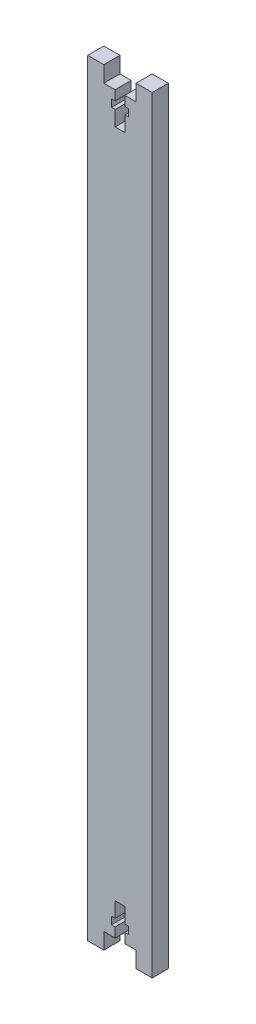
ISO-10303-21;
HEADER;
FILE_DESCRIPTION(('STEP AP214'),'2;1');
FILE_NAME('part.step','',(''),(''),'','','');
FILE_SCHEMA(('AUTOMOTIVE_DESIGN { 1 0 10303 214 1 1 1 1 }'));
ENDSEC;
DATA;
#1=APPLICATION_CONTEXT('core data for automotive mechanical design processes');
#2=APPLICATION_PROTOCOL_DEFINITION('international standard','automotive_design',2000,#1);
#3=PRODUCT_CONTEXT('',#1,'mechanical');
#4=PRODUCT('Part','Part','',(#3));
#5=PRODUCT_RELATED_PRODUCT_CATEGORY('part','',(#4));
#6=PRODUCT_DEFINITION_FORMATION('','',#4);
#7=PRODUCT_DEFINITION_CONTEXT('part definition',#1,'design');
#8=PRODUCT_DEFINITION('design','',#6,#7);
#9=PRODUCT_DEFINITION_SHAPE('','',#8);
#10=(LENGTH_UNIT() NAMED_UNIT(*) SI_UNIT(.MILLI.,.METRE.));
#11=(NAMED_UNIT(*) PLANE_ANGLE_UNIT() SI_UNIT($,.RADIAN.));
#12=(NAMED_UNIT(*) SI_UNIT($,.STERADIAN.) SOLID_ANGLE_UNIT());
#13=UNCERTAINTY_MEASURE_WITH_UNIT(LENGTH_MEASURE(1.E-05),#10,'distance_accuracy_value','');
#14=(GEOMETRIC_REPRESENTATION_CONTEXT(3) GLOBAL_UNCERTAINTY_ASSIGNED_CONTEXT((#13)) GLOBAL_UNIT_ASSIGNED_CONTEXT((#10,
#11,#12)) REPRESENTATION_CONTEXT('',''));
#15=CARTESIAN_POINT('',(0.,0.,0.));
#16=DIRECTION('',(0.,0.,1.));
#17=DIRECTION('',(1.,0.,0.));
#18=AXIS2_PLACEMENT_3D('',#15,#16,#17);
#19=CARTESIAN_POINT('',(5.,0.,5.));
#20=DIRECTION('',(0.,1.,0.));
#21=DIRECTION('',(0.,0.,1.));
#22=AXIS2_PLACEMENT_3D('',#19,#20,#21);
#23=PLANE('',#22);
#24=DIRECTION('',(1.,0.,0.));
#25=VECTOR('',#24,1.);
#26=CARTESIAN_POINT('',(5.,0.,0.));
#27=LINE('',#26,#25);
#28=CARTESIAN_POINT('',(0.,0.,0.));
#29=VERTEX_POINT('',#28);
#30=CARTESIAN_POINT('',(5.,0.,0.));
#31=VERTEX_POINT('',#30);
#32=EDGE_CURVE('E298',#29,#31,#27,.T.);
#33=ORIENTED_EDGE('',*,*,#32,.T.);
#34=DIRECTION('',(0.,0.,-1.));
#35=VECTOR('',#34,1.);
#36=CARTESIAN_POINT('',(5.,0.,5.));
#37=LINE('',#36,#35);
#38=CARTESIAN_POINT('',(5.,0.,5.));
#39=VERTEX_POINT('',#38);
#40=EDGE_CURVE('E42',#39,#31,#37,.T.);
#41=ORIENTED_EDGE('',*,*,#40,.F.);
#42=DIRECTION('',(1.,0.,0.));
#43=VECTOR('',#42,1.);
#44=CARTESIAN_POINT('',(5.,0.,5.));
#45=LINE('',#44,#43);
#46=CARTESIAN_POINT('',(0.,0.,5.));
#47=VERTEX_POINT('',#46);
#48=EDGE_CURVE('E556',#47,#39,#45,.T.);
#49=ORIENTED_EDGE('',*,*,#48,.F.);
#50=DIRECTION('',(0.,0.,-1.));
#51=VECTOR('',#50,1.);
#52=CARTESIAN_POINT('',(0.,0.,5.));
#53=LINE('',#52,#51);
#54=EDGE_CURVE('E11',#47,#29,#53,.T.);
#55=ORIENTED_EDGE('',*,*,#54,.T.);
#56=EDGE_LOOP('',(#33,#41,#49,#55));
#57=FACE_BOUND('',#56,.T.);
#58=ADVANCED_FACE('F34',(#57),#23,.F.);
#59=CARTESIAN_POINT('',(5.,0.,5.));
#60=DIRECTION('',(-1.,0.,0.));
#61=DIRECTION('',(0.,-1.,0.));
#62=AXIS2_PLACEMENT_3D('',#59,#60,#61);
#63=PLANE('',#62);
#64=DIRECTION('',(0.,1.,0.));
#65=VECTOR('',#64,1.);
#66=CARTESIAN_POINT('',(5.,0.,0.));
#67=LINE('',#66,#65);
#68=CARTESIAN_POINT('',(5.,5.,0.));
#69=VERTEX_POINT('',#68);
#70=EDGE_CURVE('E300',#31,#69,#67,.T.);
#71=ORIENTED_EDGE('',*,*,#70,.T.);
#72=DIRECTION('',(0.,0.,-1.));
#73=VECTOR('',#72,1.);
#74=CARTESIAN_POINT('',(5.,5.,5.));
#75=LINE('',#74,#73);
#76=CARTESIAN_POINT('',(5.,5.,5.));
#77=VERTEX_POINT('',#76);
#78=EDGE_CURVE('E458',#77,#69,#75,.T.);
#79=ORIENTED_EDGE('',*,*,#78,.F.);
#80=DIRECTION('',(0.,1.,0.));
#81=VECTOR('',#80,1.);
#82=CARTESIAN_POINT('',(5.,0.,5.));
#83=LINE('',#82,#81);
#84=EDGE_CURVE('E467',#39,#77,#83,.T.);
#85=ORIENTED_EDGE('',*,*,#84,.F.);
#86=ORIENTED_EDGE('',*,*,#40,.T.);
#87=EDGE_LOOP('',(#71,#79,#85,#86));
#88=FACE_BOUND('',#87,.T.);
#89=ADVANCED_FACE('F465',(#88),#63,.F.);
#90=CARTESIAN_POINT('',(8.50000000000001,5.,5.));
#91=DIRECTION('',(0.,1.,0.));
#92=DIRECTION('',(-1.,0.,0.));
#93=AXIS2_PLACEMENT_3D('',#90,#91,#92);
#94=PLANE('',#93);
#95=DIRECTION('',(1.,0.,0.));
#96=VECTOR('',#95,1.);
#97=CARTESIAN_POINT('',(8.50000000000001,5.,0.));
#98=LINE('',#97,#96);
#99=CARTESIAN_POINT('',(8.50000000000001,5.,0.));
#100=VERTEX_POINT('',#99);
#101=EDGE_CURVE('E302',#69,#100,#98,.T.);
#102=ORIENTED_EDGE('',*,*,#101,.T.);
#103=DIRECTION('',(0.,0.,-1.));
#104=VECTOR('',#103,1.);
#105=CARTESIAN_POINT('',(8.50000000000001,5.,5.));
#106=LINE('',#105,#104);
#107=CARTESIAN_POINT('',(8.50000000000001,5.,5.));
#108=VERTEX_POINT('',#107);
#109=EDGE_CURVE('E455',#108,#100,#106,.T.);
#110=ORIENTED_EDGE('',*,*,#109,.F.);
#111=DIRECTION('',(1.,0.,0.));
#112=VECTOR('',#111,1.);
#113=CARTESIAN_POINT('',(8.50000000000001,5.,5.));
#114=LINE('',#113,#112);
#115=EDGE_CURVE('E488',#77,#108,#114,.T.);
#116=ORIENTED_EDGE('',*,*,#115,.F.);
#117=ORIENTED_EDGE('',*,*,#78,.T.);
#118=EDGE_LOOP('',(#102,#110,#116,#117));
#119=FACE_BOUND('',#118,.T.);
#120=ADVANCED_FACE('F479',(#119),#94,.F.);
#121=CARTESIAN_POINT('',(8.5,8.,5.));
#122=DIRECTION('',(-1.,0.,0.));
#123=DIRECTION('',(0.,-1.,0.));
#124=AXIS2_PLACEMENT_3D('',#121,#122,#123);
#125=PLANE('',#124);
#126=DIRECTION('',(0.,1.,0.));
#127=VECTOR('',#126,1.);
#128=CARTESIAN_POINT('',(8.5,8.,0.));
#129=LINE('',#128,#127);
#130=CARTESIAN_POINT('',(8.5,8.,0.));
#131=VERTEX_POINT('',#130);
#132=EDGE_CURVE('E304',#100,#131,#129,.T.);
#133=ORIENTED_EDGE('',*,*,#132,.T.);
#134=DIRECTION('',(0.,0.,-1.));
#135=VECTOR('',#134,1.);
#136=CARTESIAN_POINT('',(8.5,8.,5.));
#137=LINE('',#136,#135);
#138=CARTESIAN_POINT('',(8.5,8.,5.));
#139=VERTEX_POINT('',#138);
#140=EDGE_CURVE('E452',#139,#131,#137,.T.);
#141=ORIENTED_EDGE('',*,*,#140,.F.);
#142=DIRECTION('',(0.,1.,0.));
#143=VECTOR('',#142,1.);
#144=CARTESIAN_POINT('',(8.5,8.,5.));
#145=LINE('',#144,#143);
#146=EDGE_CURVE('E485',#108,#139,#145,.T.);
#147=ORIENTED_EDGE('',*,*,#146,.F.);
#148=ORIENTED_EDGE('',*,*,#109,.T.);
#149=EDGE_LOOP('',(#133,#141,#147,#148));
#150=FACE_BOUND('',#149,.T.);
#151=ADVANCED_FACE('F483',(#150),#125,.F.);
#152=CARTESIAN_POINT('',(8.5,8.,5.));
#153=DIRECTION('',(0.,-1.,0.));
#154=DIRECTION('',(1.,0.,0.));
#155=AXIS2_PLACEMENT_3D('',#152,#153,#154);
#156=PLANE('',#155);
#157=DIRECTION('',(-1.,0.,0.));
#158=VECTOR('',#157,1.);
#159=CARTESIAN_POINT('',(8.5,8.,0.));
#160=LINE('',#159,#158);
#161=CARTESIAN_POINT('',(7.4,8.00000000000001,0.));
#162=VERTEX_POINT('',#161);
#163=EDGE_CURVE('E306',#131,#162,#160,.T.);
#164=ORIENTED_EDGE('',*,*,#163,.T.);
#165=DIRECTION('',(0.,0.,-1.));
#166=VECTOR('',#165,1.);
#167=CARTESIAN_POINT('',(7.4,8.00000000000001,5.));
#168=LINE('',#167,#166);
#169=CARTESIAN_POINT('',(7.4,8.00000000000001,5.));
#170=VERTEX_POINT('',#169);
#171=EDGE_CURVE('E449',#170,#162,#168,.T.);
#172=ORIENTED_EDGE('',*,*,#171,.F.);
#173=DIRECTION('',(-1.,0.,0.));
#174=VECTOR('',#173,1.);
#175=CARTESIAN_POINT('',(8.5,8.,5.));
#176=LINE('',#175,#174);
#177=EDGE_CURVE('E487',#139,#170,#176,.T.);
#178=ORIENTED_EDGE('',*,*,#177,.F.);
#179=ORIENTED_EDGE('',*,*,#140,.T.);
#180=EDGE_LOOP('',(#164,#172,#178,#179));
#181=FACE_BOUND('',#180,.T.);
#182=ADVANCED_FACE('F570',(#181),#156,.F.);
#183=CARTESIAN_POINT('',(7.4,8.00000000000001,5.));
#184=DIRECTION('',(-1.,0.,0.));
#185=DIRECTION('',(0.,-1.,0.));
#186=AXIS2_PLACEMENT_3D('',#183,#184,#185);
#187=PLANE('',#186);
#188=DIRECTION('',(0.,1.,0.));
#189=VECTOR('',#188,1.);
#190=CARTESIAN_POINT('',(7.4,8.00000000000001,0.));
#191=LINE('',#190,#189);
#192=CARTESIAN_POINT('',(7.4,10.3,0.));
#193=VERTEX_POINT('',#192);
#194=EDGE_CURVE('E308',#162,#193,#191,.T.);
#195=ORIENTED_EDGE('',*,*,#194,.T.);
#196=DIRECTION('',(0.,0.,-1.));
#197=VECTOR('',#196,1.);
#198=CARTESIAN_POINT('',(7.4,10.3,5.));
#199=LINE('',#198,#197);
#200=CARTESIAN_POINT('',(7.4,10.3,5.));
#201=VERTEX_POINT('',#200);
#202=EDGE_CURVE('E446',#201,#193,#199,.T.);
#203=ORIENTED_EDGE('',*,*,#202,.F.);
#204=DIRECTION('',(0.,1.,0.));
#205=VECTOR('',#204,1.);
#206=CARTESIAN_POINT('',(7.4,8.00000000000001,5.));
#207=LINE('',#206,#205);
#208=EDGE_CURVE('E490',#170,#201,#207,.T.);
#209=ORIENTED_EDGE('',*,*,#208,.F.);
#210=ORIENTED_EDGE('',*,*,#171,.T.);
#211=EDGE_LOOP('',(#195,#203,#209,#210));
#212=FACE_BOUND('',#211,.T.);
#213=ADVANCED_FACE('F573',(#212),#187,.F.);
#214=CARTESIAN_POINT('',(7.4,10.3,5.));
#215=DIRECTION('',(0.,1.,0.));
#216=DIRECTION('',(-1.,0.,0.));
#217=AXIS2_PLACEMENT_3D('',#214,#215,#216);
#218=PLANE('',#217);
#219=DIRECTION('',(1.,0.,0.));
#220=VECTOR('',#219,1.);
#221=CARTESIAN_POINT('',(7.4,10.3,0.));
#222=LINE('',#221,#220);
#223=CARTESIAN_POINT('',(8.5,10.3,0.));
#224=VERTEX_POINT('',#223);
#225=EDGE_CURVE('E310',#193,#224,#222,.T.);
#226=ORIENTED_EDGE('',*,*,#225,.T.);
#227=DIRECTION('',(0.,0.,-1.));
#228=VECTOR('',#227,1.);
#229=CARTESIAN_POINT('',(8.5,10.3,5.));
#230=LINE('',#229,#228);
#231=CARTESIAN_POINT('',(8.5,10.3,5.));
#232=VERTEX_POINT('',#231);
#233=EDGE_CURVE('E443',#232,#224,#230,.T.);
#234=ORIENTED_EDGE('',*,*,#233,.F.);
#235=DIRECTION('',(1.,0.,0.));
#236=VECTOR('',#235,1.);
#237=CARTESIAN_POINT('',(7.4,10.3,5.));
#238=LINE('',#237,#236);
#239=EDGE_CURVE('E496',#201,#232,#238,.T.);
#240=ORIENTED_EDGE('',*,*,#239,.F.);
#241=ORIENTED_EDGE('',*,*,#202,.T.);
#242=EDGE_LOOP('',(#226,#234,#240,#241));
#243=FACE_BOUND('',#242,.T.);
#244=ADVANCED_FACE('F577',(#243),#218,.F.);
#245=CARTESIAN_POINT('',(8.5,15.,5.));
#246=DIRECTION('',(-1.,0.,0.));
#247=DIRECTION('',(0.,-1.,0.));
#248=AXIS2_PLACEMENT_3D('',#245,#246,#247);
#249=PLANE('',#248);
#250=DIRECTION('',(0.,1.,0.));
#251=VECTOR('',#250,1.);
#252=CARTESIAN_POINT('',(8.5,15.,0.));
#253=LINE('',#252,#251);
#254=CARTESIAN_POINT('',(8.5,15.,0.));
#255=VERTEX_POINT('',#254);
#256=EDGE_CURVE('E312',#224,#255,#253,.T.);
#257=ORIENTED_EDGE('',*,*,#256,.T.);
#258=DIRECTION('',(0.,0.,-1.));
#259=VECTOR('',#258,1.);
#260=CARTESIAN_POINT('',(8.5,15.,5.));
#261=LINE('',#260,#259);
#262=CARTESIAN_POINT('',(8.5,15.,5.));
#263=VERTEX_POINT('',#262);
#264=EDGE_CURVE('E440',#263,#255,#261,.T.);
#265=ORIENTED_EDGE('',*,*,#264,.F.);
#266=DIRECTION('',(0.,1.,0.));
#267=VECTOR('',#266,1.);
#268=CARTESIAN_POINT('',(8.5,15.,5.));
#269=LINE('',#268,#267);
#270=EDGE_CURVE('E498',#232,#263,#269,.T.);
#271=ORIENTED_EDGE('',*,*,#270,.F.);
#272=ORIENTED_EDGE('',*,*,#233,.T.);
#273=EDGE_LOOP('',(#257,#265,#271,#272));
#274=FACE_BOUND('',#273,.T.);
#275=ADVANCED_FACE('F581',(#274),#249,.F.);
#276=CARTESIAN_POINT('',(11.5,15.,5.));
#277=DIRECTION('',(0.,1.,0.));
#278=DIRECTION('',(0.,0.,1.));
#279=AXIS2_PLACEMENT_3D('',#276,#277,#278);
#280=PLANE('',#279);
#281=DIRECTION('',(1.,0.,0.));
#282=VECTOR('',#281,1.);
#283=CARTESIAN_POINT('',(11.5,15.,0.));
#284=LINE('',#283,#282);
#285=CARTESIAN_POINT('',(11.5,15.,0.));
#286=VERTEX_POINT('',#285);
#287=EDGE_CURVE('E314',#255,#286,#284,.T.);
#288=ORIENTED_EDGE('',*,*,#287,.T.);
#289=DIRECTION('',(0.,0.,-1.));
#290=VECTOR('',#289,1.);
#291=CARTESIAN_POINT('',(11.5,15.,5.));
#292=LINE('',#291,#290);
#293=CARTESIAN_POINT('',(11.5,15.,5.));
#294=VERTEX_POINT('',#293);
#295=EDGE_CURVE('E437',#294,#286,#292,.T.);
#296=ORIENTED_EDGE('',*,*,#295,.F.);
#297=DIRECTION('',(1.,0.,0.));
#298=VECTOR('',#297,1.);
#299=CARTESIAN_POINT('',(11.5,15.,5.));
#300=LINE('',#299,#298);
#301=EDGE_CURVE('E500',#263,#294,#300,.T.);
#302=ORIENTED_EDGE('',*,*,#301,.F.);
#303=ORIENTED_EDGE('',*,*,#264,.T.);
#304=EDGE_LOOP('',(#288,#296,#302,#303));
#305=FACE_BOUND('',#304,.T.);
#306=ADVANCED_FACE('F585',(#305),#280,.F.);
#307=CARTESIAN_POINT('',(11.5,10.3,5.));
#308=DIRECTION('',(1.,0.,0.));
#309=DIRECTION('',(0.,0.,-1.));
#310=AXIS2_PLACEMENT_3D('',#307,#308,#309);
#311=PLANE('',#310);
#312=DIRECTION('',(0.,-1.,0.));
#313=VECTOR('',#312,1.);
#314=CARTESIAN_POINT('',(11.5,10.3,0.));
#315=LINE('',#314,#313);
#316=CARTESIAN_POINT('',(11.5,10.3,0.));
#317=VERTEX_POINT('',#316);
#318=EDGE_CURVE('E316',#286,#317,#315,.T.);
#319=ORIENTED_EDGE('',*,*,#318,.T.);
#320=DIRECTION('',(0.,0.,-1.));
#321=VECTOR('',#320,1.);
#322=CARTESIAN_POINT('',(11.5,10.3,5.));
#323=LINE('',#322,#321);
#324=CARTESIAN_POINT('',(11.5,10.3,5.));
#325=VERTEX_POINT('',#324);
#326=EDGE_CURVE('E434',#325,#317,#323,.T.);
#327=ORIENTED_EDGE('',*,*,#326,.F.);
#328=DIRECTION('',(0.,-1.,0.));
#329=VECTOR('',#328,1.);
#330=CARTESIAN_POINT('',(11.5,10.3,5.));
#331=LINE('',#330,#329);
#332=EDGE_CURVE('E502',#294,#325,#331,.T.);
#333=ORIENTED_EDGE('',*,*,#332,.F.);
#334=ORIENTED_EDGE('',*,*,#295,.T.);
#335=EDGE_LOOP('',(#319,#327,#333,#334));
#336=FACE_BOUND('',#335,.T.);
#337=ADVANCED_FACE('F589',(#336),#311,.F.);
#338=CARTESIAN_POINT('',(11.5,10.3,5.));
#339=DIRECTION('',(0.,1.,0.));
#340=DIRECTION('',(-1.,0.,0.));
#341=AXIS2_PLACEMENT_3D('',#338,#339,#340);
#342=PLANE('',#341);
#343=DIRECTION('',(1.,0.,0.));
#344=VECTOR('',#343,1.);
#345=CARTESIAN_POINT('',(11.5,10.3,0.));
#346=LINE('',#345,#344);
#347=CARTESIAN_POINT('',(12.6,10.3,0.));
#348=VERTEX_POINT('',#347);
#349=EDGE_CURVE('E318',#317,#348,#346,.T.);
#350=ORIENTED_EDGE('',*,*,#349,.T.);
#351=DIRECTION('',(0.,0.,-1.));
#352=VECTOR('',#351,1.);
#353=CARTESIAN_POINT('',(12.6,10.3,5.));
#354=LINE('',#353,#352);
#355=CARTESIAN_POINT('',(12.6,10.3,5.));
#356=VERTEX_POINT('',#355);
#357=EDGE_CURVE('E431',#356,#348,#354,.T.);
#358=ORIENTED_EDGE('',*,*,#357,.F.);
#359=DIRECTION('',(1.,0.,0.));
#360=VECTOR('',#359,1.);
#361=CARTESIAN_POINT('',(11.5,10.3,5.));
#362=LINE('',#361,#360);
#363=EDGE_CURVE('E504',#325,#356,#362,.T.);
#364=ORIENTED_EDGE('',*,*,#363,.F.);
#365=ORIENTED_EDGE('',*,*,#326,.T.);
#366=EDGE_LOOP('',(#350,#358,#364,#365));
#367=FACE_BOUND('',#366,.T.);
#368=ADVANCED_FACE('F593',(#367),#342,.F.);
#369=CARTESIAN_POINT('',(12.6,10.3,5.));
#370=DIRECTION('',(1.,0.,0.));
#371=DIRECTION('',(0.,1.,0.));
#372=AXIS2_PLACEMENT_3D('',#369,#370,#371);
#373=PLANE('',#372);
#374=DIRECTION('',(0.,-1.,0.));
#375=VECTOR('',#374,1.);
#376=CARTESIAN_POINT('',(12.6,10.3,0.));
#377=LINE('',#376,#375);
#378=CARTESIAN_POINT('',(12.6,8.,0.));
#379=VERTEX_POINT('',#378);
#380=EDGE_CURVE('E320',#348,#379,#377,.T.);
#381=ORIENTED_EDGE('',*,*,#380,.T.);
#382=DIRECTION('',(0.,0.,-1.));
#383=VECTOR('',#382,1.);
#384=CARTESIAN_POINT('',(12.6,8.,5.));
#385=LINE('',#384,#383);
#386=CARTESIAN_POINT('',(12.6,8.,5.));
#387=VERTEX_POINT('',#386);
#388=EDGE_CURVE('E428',#387,#379,#385,.T.);
#389=ORIENTED_EDGE('',*,*,#388,.F.);
#390=DIRECTION('',(0.,-1.,0.));
#391=VECTOR('',#390,1.);
#392=CARTESIAN_POINT('',(12.6,10.3,5.));
#393=LINE('',#392,#391);
#394=EDGE_CURVE('E506',#356,#387,#393,.T.);
#395=ORIENTED_EDGE('',*,*,#394,.F.);
#396=ORIENTED_EDGE('',*,*,#357,.T.);
#397=EDGE_LOOP('',(#381,#389,#395,#396));
#398=FACE_BOUND('',#397,.T.);
#399=ADVANCED_FACE('F597',(#398),#373,.F.);
#400=CARTESIAN_POINT('',(12.6,8.,5.));
#401=DIRECTION('',(0.,-1.,0.));
#402=DIRECTION('',(0.,0.,-1.));
#403=AXIS2_PLACEMENT_3D('',#400,#401,#402);
#404=PLANE('',#403);
#405=DIRECTION('',(-1.,0.,0.));
#406=VECTOR('',#405,1.);
#407=CARTESIAN_POINT('',(12.6,8.,0.));
#408=LINE('',#407,#406);
#409=CARTESIAN_POINT('',(11.5,8.,0.));
#410=VERTEX_POINT('',#409);
#411=EDGE_CURVE('E322',#379,#410,#408,.T.);
#412=ORIENTED_EDGE('',*,*,#411,.T.);
#413=DIRECTION('',(0.,0.,-1.));
#414=VECTOR('',#413,1.);
#415=CARTESIAN_POINT('',(11.5,8.,5.));
#416=LINE('',#415,#414);
#417=CARTESIAN_POINT('',(11.5,8.,5.));
#418=VERTEX_POINT('',#417);
#419=EDGE_CURVE('E425',#418,#410,#416,.T.);
#420=ORIENTED_EDGE('',*,*,#419,.F.);
#421=DIRECTION('',(-1.,0.,0.));
#422=VECTOR('',#421,1.);
#423=CARTESIAN_POINT('',(12.6,8.,5.));
#424=LINE('',#423,#422);
#425=EDGE_CURVE('E508',#387,#418,#424,.T.);
#426=ORIENTED_EDGE('',*,*,#425,.F.);
#427=ORIENTED_EDGE('',*,*,#388,.T.);
#428=EDGE_LOOP('',(#412,#420,#426,#427));
#429=FACE_BOUND('',#428,.T.);
#430=ADVANCED_FACE('F601',(#429),#404,.F.);
#431=CARTESIAN_POINT('',(11.5,5.,5.));
#432=DIRECTION('',(1.,0.,0.));
#433=DIRECTION('',(0.,1.,0.));
#434=AXIS2_PLACEMENT_3D('',#431,#432,#433);
#435=PLANE('',#434);
#436=DIRECTION('',(0.,-1.,0.));
#437=VECTOR('',#436,1.);
#438=CARTESIAN_POINT('',(11.5,5.,0.));
#439=LINE('',#438,#437);
#440=CARTESIAN_POINT('',(11.5,5.,0.));
#441=VERTEX_POINT('',#440);
#442=EDGE_CURVE('E324',#410,#441,#439,.T.);
#443=ORIENTED_EDGE('',*,*,#442,.T.);
#444=DIRECTION('',(0.,0.,-1.));
#445=VECTOR('',#444,1.);
#446=CARTESIAN_POINT('',(11.5,5.,5.));
#447=LINE('',#446,#445);
#448=CARTESIAN_POINT('',(11.5,5.,5.));
#449=VERTEX_POINT('',#448);
#450=EDGE_CURVE('E422',#449,#441,#447,.T.);
#451=ORIENTED_EDGE('',*,*,#450,.F.);
#452=DIRECTION('',(0.,-1.,0.));
#453=VECTOR('',#452,1.);
#454=CARTESIAN_POINT('',(11.5,5.,5.));
#455=LINE('',#454,#453);
#456=EDGE_CURVE('E510',#418,#449,#455,.T.);
#457=ORIENTED_EDGE('',*,*,#456,.F.);
#458=ORIENTED_EDGE('',*,*,#419,.T.);
#459=EDGE_LOOP('',(#443,#451,#457,#458));
#460=FACE_BOUND('',#459,.T.);
#461=ADVANCED_FACE('F605',(#460),#435,.F.);
#462=CARTESIAN_POINT('',(11.5,5.,5.));
#463=DIRECTION('',(0.,1.,0.));
#464=DIRECTION('',(0.,0.,1.));
#465=AXIS2_PLACEMENT_3D('',#462,#463,#464);
#466=PLANE('',#465);
#467=DIRECTION('',(1.,0.,0.));
#468=VECTOR('',#467,1.);
#469=CARTESIAN_POINT('',(11.5,5.,0.));
#470=LINE('',#469,#468);
#471=CARTESIAN_POINT('',(15.,5.,0.));
#472=VERTEX_POINT('',#471);
#473=EDGE_CURVE('E326',#441,#472,#470,.T.);
#474=ORIENTED_EDGE('',*,*,#473,.T.);
#475=DIRECTION('',(0.,0.,-1.));
#476=VECTOR('',#475,1.);
#477=CARTESIAN_POINT('',(15.,5.,5.));
#478=LINE('',#477,#476);
#479=CARTESIAN_POINT('',(15.,5.,5.));
#480=VERTEX_POINT('',#479);
#481=EDGE_CURVE('E419',#480,#472,#478,.T.);
#482=ORIENTED_EDGE('',*,*,#481,.F.);
#483=DIRECTION('',(1.,0.,0.));
#484=VECTOR('',#483,1.);
#485=CARTESIAN_POINT('',(11.5,5.,5.));
#486=LINE('',#485,#484);
#487=EDGE_CURVE('E512',#449,#480,#486,.T.);
#488=ORIENTED_EDGE('',*,*,#487,.F.);
#489=ORIENTED_EDGE('',*,*,#450,.T.);
#490=EDGE_LOOP('',(#474,#482,#488,#489));
#491=FACE_BOUND('',#490,.T.);
#492=ADVANCED_FACE('F609',(#491),#466,.F.);
#493=CARTESIAN_POINT('',(15.,5.,5.));
#494=DIRECTION('',(1.,0.,0.));
#495=DIRECTION('',(0.,0.,-1.));
#496=AXIS2_PLACEMENT_3D('',#493,#494,#495);
#497=PLANE('',#496);
#498=DIRECTION('',(0.,-1.,0.));
#499=VECTOR('',#498,1.);
#500=CARTESIAN_POINT('',(15.,5.,0.));
#501=LINE('',#500,#499);
#502=CARTESIAN_POINT('',(15.,0.,0.));
#503=VERTEX_POINT('',#502);
#504=EDGE_CURVE('E328',#472,#503,#501,.T.);
#505=ORIENTED_EDGE('',*,*,#504,.T.);
#506=DIRECTION('',(0.,0.,-1.));
#507=VECTOR('',#506,1.);
#508=CARTESIAN_POINT('',(15.,0.,5.));
#509=LINE('',#508,#507);
#510=CARTESIAN_POINT('',(15.,0.,5.));
#511=VERTEX_POINT('',#510);
#512=EDGE_CURVE('E416',#511,#503,#509,.T.);
#513=ORIENTED_EDGE('',*,*,#512,.F.);
#514=DIRECTION('',(0.,-1.,0.));
#515=VECTOR('',#514,1.);
#516=CARTESIAN_POINT('',(15.,5.,5.));
#517=LINE('',#516,#515);
#518=EDGE_CURVE('E514',#480,#511,#517,.T.);
#519=ORIENTED_EDGE('',*,*,#518,.F.);
#520=ORIENTED_EDGE('',*,*,#481,.T.);
#521=EDGE_LOOP('',(#505,#513,#519,#520));
#522=FACE_BOUND('',#521,.T.);
#523=ADVANCED_FACE('F613',(#522),#497,.F.);
#524=CARTESIAN_POINT('',(15.,0.,5.));
#525=DIRECTION('',(0.,1.,0.));
#526=DIRECTION('',(0.,0.,1.));
#527=AXIS2_PLACEMENT_3D('',#524,#525,#526);
#528=PLANE('',#527);
#529=DIRECTION('',(1.,0.,0.));
#530=VECTOR('',#529,1.);
#531=CARTESIAN_POINT('',(15.,0.,0.));
#532=LINE('',#531,#530);
#533=CARTESIAN_POINT('',(20.,0.,0.));
#534=VERTEX_POINT('',#533);
#535=EDGE_CURVE('E330',#503,#534,#532,.T.);
#536=ORIENTED_EDGE('',*,*,#535,.T.);
#537=DIRECTION('',(0.,0.,-1.));
#538=VECTOR('',#537,1.);
#539=CARTESIAN_POINT('',(20.,0.,5.));
#540=LINE('',#539,#538);
#541=CARTESIAN_POINT('',(20.,0.,5.));
#542=VERTEX_POINT('',#541);
#543=EDGE_CURVE('E413',#542,#534,#540,.T.);
#544=ORIENTED_EDGE('',*,*,#543,.F.);
#545=DIRECTION('',(1.,0.,0.));
#546=VECTOR('',#545,1.);
#547=CARTESIAN_POINT('',(15.,0.,5.));
#548=LINE('',#547,#546);
#549=EDGE_CURVE('E516',#511,#542,#548,.T.);
#550=ORIENTED_EDGE('',*,*,#549,.F.);
#551=ORIENTED_EDGE('',*,*,#512,.T.);
#552=EDGE_LOOP('',(#536,#544,#550,#551));
#553=FACE_BOUND('',#552,.T.);
#554=ADVANCED_FACE('F617',(#553),#528,.F.);
#555=CARTESIAN_POINT('',(20.0000000000001,238.,5.));
#556=DIRECTION('',(-1.,0.,0.));
#557=DIRECTION('',(0.,-1.,0.));
#558=AXIS2_PLACEMENT_3D('',#555,#556,#557);
#559=PLANE('',#558);
#560=DIRECTION('',(0.,1.,0.));
#561=VECTOR('',#560,1.);
#562=CARTESIAN_POINT('',(20.0000000000001,238.,0.));
#563=LINE('',#562,#561);
#564=CARTESIAN_POINT('',(20.0000000000001,238.,0.));
#565=VERTEX_POINT('',#564);
#566=EDGE_CURVE('E333',#534,#565,#563,.T.);
#567=ORIENTED_EDGE('',*,*,#566,.T.);
#568=DIRECTION('',(0.,0.,-1.));
#569=VECTOR('',#568,1.);
#570=CARTESIAN_POINT('',(20.0000000000001,238.,5.));
#571=LINE('',#570,#569);
#572=CARTESIAN_POINT('',(20.0000000000001,238.,5.));
#573=VERTEX_POINT('',#572);
#574=EDGE_CURVE('E410',#573,#565,#571,.T.);
#575=ORIENTED_EDGE('',*,*,#574,.F.);
#576=DIRECTION('',(0.,1.,0.));
#577=VECTOR('',#576,1.);
#578=CARTESIAN_POINT('',(20.,0.,5.));
#579=LINE('',#578,#577);
#580=EDGE_CURVE('E518',#542,#573,#579,.T.);
#581=ORIENTED_EDGE('',*,*,#580,.F.);
#582=ORIENTED_EDGE('',*,*,#543,.T.);
#583=EDGE_LOOP('',(#567,#575,#581,#582));
#584=FACE_BOUND('',#583,.T.);
#585=ADVANCED_FACE('F621',(#584),#559,.F.);
#586=CARTESIAN_POINT('',(15.0000000000001,238.,5.));
#587=DIRECTION('',(0.,-1.,0.));
#588=DIRECTION('',(0.,0.,-1.));
#589=AXIS2_PLACEMENT_3D('',#586,#587,#588);
#590=PLANE('',#589);
#591=DIRECTION('',(-1.,0.,0.));
#592=VECTOR('',#591,1.);
#593=CARTESIAN_POINT('',(15.0000000000001,238.,0.));
#594=LINE('',#593,#592);
#595=CARTESIAN_POINT('',(15.0000000000001,238.,0.));
#596=VERTEX_POINT('',#595);
#597=EDGE_CURVE('E335',#565,#596,#594,.T.);
#598=ORIENTED_EDGE('',*,*,#597,.T.);
#599=DIRECTION('',(0.,0.,-1.));
#600=VECTOR('',#599,1.);
#601=CARTESIAN_POINT('',(15.0000000000001,238.,5.));
#602=LINE('',#601,#600);
#603=CARTESIAN_POINT('',(15.0000000000001,238.,5.));
#604=VERTEX_POINT('',#603);
#605=EDGE_CURVE('E407',#604,#596,#602,.T.);
#606=ORIENTED_EDGE('',*,*,#605,.F.);
#607=DIRECTION('',(-1.,0.,0.));
#608=VECTOR('',#607,1.);
#609=CARTESIAN_POINT('',(15.0000000000001,238.,5.));
#610=LINE('',#609,#608);
#611=EDGE_CURVE('E520',#573,#604,#610,.T.);
#612=ORIENTED_EDGE('',*,*,#611,.F.);
#613=ORIENTED_EDGE('',*,*,#574,.T.);
#614=EDGE_LOOP('',(#598,#606,#612,#613));
#615=FACE_BOUND('',#614,.T.);
#616=ADVANCED_FACE('F625',(#615),#590,.F.);
#617=CARTESIAN_POINT('',(15.0000000000001,238.,5.));
#618=DIRECTION('',(1.,0.,0.));
#619=DIRECTION('',(0.,1.,0.));
#620=AXIS2_PLACEMENT_3D('',#617,#618,#619);
#621=PLANE('',#620);
#622=DIRECTION('',(0.,-1.,0.));
#623=VECTOR('',#622,1.);
#624=CARTESIAN_POINT('',(15.0000000000001,238.,0.));
#625=LINE('',#624,#623);
#626=CARTESIAN_POINT('',(15.,233.,0.));
#627=VERTEX_POINT('',#626);
#628=EDGE_CURVE('E337',#596,#627,#625,.T.);
#629=ORIENTED_EDGE('',*,*,#628,.T.);
#630=DIRECTION('',(0.,0.,-1.));
#631=VECTOR('',#630,1.);
#632=CARTESIAN_POINT('',(15.,233.,5.));
#633=LINE('',#632,#631);
#634=CARTESIAN_POINT('',(15.,233.,5.));
#635=VERTEX_POINT('',#634);
#636=EDGE_CURVE('E404',#635,#627,#633,.T.);
#637=ORIENTED_EDGE('',*,*,#636,.F.);
#638=DIRECTION('',(0.,-1.,0.));
#639=VECTOR('',#638,1.);
#640=CARTESIAN_POINT('',(15.0000000000001,238.,5.));
#641=LINE('',#640,#639);
#642=EDGE_CURVE('E522',#604,#635,#641,.T.);
#643=ORIENTED_EDGE('',*,*,#642,.F.);
#644=ORIENTED_EDGE('',*,*,#605,.T.);
#645=EDGE_LOOP('',(#629,#637,#643,#644));
#646=FACE_BOUND('',#645,.T.);
#647=ADVANCED_FACE('F629',(#646),#621,.F.);
#648=CARTESIAN_POINT('',(11.5,233.,5.));
#649=DIRECTION('',(0.,-1.,0.));
#650=DIRECTION('',(1.,0.,0.));
#651=AXIS2_PLACEMENT_3D('',#648,#649,#650);
#652=PLANE('',#651);
#653=DIRECTION('',(-1.,0.,0.));
#654=VECTOR('',#653,1.);
#655=CARTESIAN_POINT('',(11.5,233.,0.));
#656=LINE('',#655,#654);
#657=CARTESIAN_POINT('',(11.5,233.,0.));
#658=VERTEX_POINT('',#657);
#659=EDGE_CURVE('E339',#627,#658,#656,.T.);
#660=ORIENTED_EDGE('',*,*,#659,.T.);
#661=DIRECTION('',(0.,0.,-1.));
#662=VECTOR('',#661,1.);
#663=CARTESIAN_POINT('',(11.5,233.,5.));
#664=LINE('',#663,#662);
#665=CARTESIAN_POINT('',(11.5,233.,5.));
#666=VERTEX_POINT('',#665);
#667=EDGE_CURVE('E401',#666,#658,#664,.T.);
#668=ORIENTED_EDGE('',*,*,#667,.F.);
#669=DIRECTION('',(-1.,0.,0.));
#670=VECTOR('',#669,1.);
#671=CARTESIAN_POINT('',(11.5,233.,5.));
#672=LINE('',#671,#670);
#673=EDGE_CURVE('E524',#635,#666,#672,.T.);
#674=ORIENTED_EDGE('',*,*,#673,.F.);
#675=ORIENTED_EDGE('',*,*,#636,.T.);
#676=EDGE_LOOP('',(#660,#668,#674,#675));
#677=FACE_BOUND('',#676,.T.);
#678=ADVANCED_FACE('F633',(#677),#652,.F.);
#679=CARTESIAN_POINT('',(11.5,230.,5.));
#680=DIRECTION('',(1.,0.,0.));
#681=DIRECTION('',(0.,1.,0.));
#682=AXIS2_PLACEMENT_3D('',#679,#680,#681);
#683=PLANE('',#682);
#684=DIRECTION('',(0.,-1.,0.));
#685=VECTOR('',#684,1.);
#686=CARTESIAN_POINT('',(11.5,230.,0.));
#687=LINE('',#686,#685);
#688=CARTESIAN_POINT('',(11.5,230.,0.));
#689=VERTEX_POINT('',#688);
#690=EDGE_CURVE('E341',#658,#689,#687,.T.);
#691=ORIENTED_EDGE('',*,*,#690,.T.);
#692=DIRECTION('',(0.,0.,-1.));
#693=VECTOR('',#692,1.);
#694=CARTESIAN_POINT('',(11.5,230.,5.));
#695=LINE('',#694,#693);
#696=CARTESIAN_POINT('',(11.5,230.,5.));
#697=VERTEX_POINT('',#696);
#698=EDGE_CURVE('E398',#697,#689,#695,.T.);
#699=ORIENTED_EDGE('',*,*,#698,.F.);
#700=DIRECTION('',(0.,-1.,0.));
#701=VECTOR('',#700,1.);
#702=CARTESIAN_POINT('',(11.5,230.,5.));
#703=LINE('',#702,#701);
#704=EDGE_CURVE('E526',#666,#697,#703,.T.);
#705=ORIENTED_EDGE('',*,*,#704,.F.);
#706=ORIENTED_EDGE('',*,*,#667,.T.);
#707=EDGE_LOOP('',(#691,#699,#705,#706));
#708=FACE_BOUND('',#707,.T.);
#709=ADVANCED_FACE('F637',(#708),#683,.F.);
#710=CARTESIAN_POINT('',(11.5,230.,5.));
#711=DIRECTION('',(0.,1.,0.));
#712=DIRECTION('',(0.,0.,1.));
#713=AXIS2_PLACEMENT_3D('',#710,#711,#712);
#714=PLANE('',#713);
#715=DIRECTION('',(1.,0.,0.));
#716=VECTOR('',#715,1.);
#717=CARTESIAN_POINT('',(11.5,230.,0.));
#718=LINE('',#717,#716);
#719=CARTESIAN_POINT('',(12.6,230.,0.));
#720=VERTEX_POINT('',#719);
#721=EDGE_CURVE('E343',#689,#720,#718,.T.);
#722=ORIENTED_EDGE('',*,*,#721,.T.);
#723=DIRECTION('',(0.,0.,-1.));
#724=VECTOR('',#723,1.);
#725=CARTESIAN_POINT('',(12.6,230.,5.));
#726=LINE('',#725,#724);
#727=CARTESIAN_POINT('',(12.6,230.,5.));
#728=VERTEX_POINT('',#727);
#729=EDGE_CURVE('E395',#728,#720,#726,.T.);
#730=ORIENTED_EDGE('',*,*,#729,.F.);
#731=DIRECTION('',(1.,0.,0.));
#732=VECTOR('',#731,1.);
#733=CARTESIAN_POINT('',(11.5,230.,5.));
#734=LINE('',#733,#732);
#735=EDGE_CURVE('E528',#697,#728,#734,.T.);
#736=ORIENTED_EDGE('',*,*,#735,.F.);
#737=ORIENTED_EDGE('',*,*,#698,.T.);
#738=EDGE_LOOP('',(#722,#730,#736,#737));
#739=FACE_BOUND('',#738,.T.);
#740=ADVANCED_FACE('F641',(#739),#714,.F.);
#741=CARTESIAN_POINT('',(12.6,230.,5.));
#742=DIRECTION('',(1.,0.,0.));
#743=DIRECTION('',(0.,1.,0.));
#744=AXIS2_PLACEMENT_3D('',#741,#742,#743);
#745=PLANE('',#744);
#746=DIRECTION('',(0.,-1.,0.));
#747=VECTOR('',#746,1.);
#748=CARTESIAN_POINT('',(12.6,230.,0.));
#749=LINE('',#748,#747);
#750=CARTESIAN_POINT('',(12.6,227.7,0.));
#751=VERTEX_POINT('',#750);
#752=EDGE_CURVE('E345',#720,#751,#749,.T.);
#753=ORIENTED_EDGE('',*,*,#752,.T.);
#754=DIRECTION('',(0.,0.,-1.));
#755=VECTOR('',#754,1.);
#756=CARTESIAN_POINT('',(12.6,227.7,5.));
#757=LINE('',#756,#755);
#758=CARTESIAN_POINT('',(12.6,227.7,5.));
#759=VERTEX_POINT('',#758);
#760=EDGE_CURVE('E392',#759,#751,#757,.T.);
#761=ORIENTED_EDGE('',*,*,#760,.F.);
#762=DIRECTION('',(0.,-1.,0.));
#763=VECTOR('',#762,1.);
#764=CARTESIAN_POINT('',(12.6,230.,5.));
#765=LINE('',#764,#763);
#766=EDGE_CURVE('E530',#728,#759,#765,.T.);
#767=ORIENTED_EDGE('',*,*,#766,.F.);
#768=ORIENTED_EDGE('',*,*,#729,.T.);
#769=EDGE_LOOP('',(#753,#761,#767,#768));
#770=FACE_BOUND('',#769,.T.);
#771=ADVANCED_FACE('F645',(#770),#745,.F.);
#772=CARTESIAN_POINT('',(12.6,227.7,5.));
#773=DIRECTION('',(0.,-1.,0.));
#774=DIRECTION('',(0.,0.,-1.));
#775=AXIS2_PLACEMENT_3D('',#772,#773,#774);
#776=PLANE('',#775);
#777=DIRECTION('',(-1.,0.,0.));
#778=VECTOR('',#777,1.);
#779=CARTESIAN_POINT('',(12.6,227.7,0.));
#780=LINE('',#779,#778);
#781=CARTESIAN_POINT('',(11.5,227.7,0.));
#782=VERTEX_POINT('',#781);
#783=EDGE_CURVE('E347',#751,#782,#780,.T.);
#784=ORIENTED_EDGE('',*,*,#783,.T.);
#785=DIRECTION('',(0.,0.,-1.));
#786=VECTOR('',#785,1.);
#787=CARTESIAN_POINT('',(11.5,227.7,5.));
#788=LINE('',#787,#786);
#789=CARTESIAN_POINT('',(11.5,227.7,5.));
#790=VERTEX_POINT('',#789);
#791=EDGE_CURVE('E389',#790,#782,#788,.T.);
#792=ORIENTED_EDGE('',*,*,#791,.F.);
#793=DIRECTION('',(-1.,0.,0.));
#794=VECTOR('',#793,1.);
#795=CARTESIAN_POINT('',(12.6,227.7,5.));
#796=LINE('',#795,#794);
#797=EDGE_CURVE('E532',#759,#790,#796,.T.);
#798=ORIENTED_EDGE('',*,*,#797,.F.);
#799=ORIENTED_EDGE('',*,*,#760,.T.);
#800=EDGE_LOOP('',(#784,#792,#798,#799));
#801=FACE_BOUND('',#800,.T.);
#802=ADVANCED_FACE('F649',(#801),#776,.F.);
#803=CARTESIAN_POINT('',(11.5000000000001,223.,5.));
#804=DIRECTION('',(1.,0.,0.));
#805=DIRECTION('',(0.,1.,0.));
#806=AXIS2_PLACEMENT_3D('',#803,#804,#805);
#807=PLANE('',#806);
#808=DIRECTION('',(0.,-1.,0.));
#809=VECTOR('',#808,1.);
#810=CARTESIAN_POINT('',(11.5000000000001,223.,0.));
#811=LINE('',#810,#809);
#812=CARTESIAN_POINT('',(11.5000000000001,223.,0.));
#813=VERTEX_POINT('',#812);
#814=EDGE_CURVE('E349',#782,#813,#811,.T.);
#815=ORIENTED_EDGE('',*,*,#814,.T.);
#816=DIRECTION('',(0.,0.,-1.));
#817=VECTOR('',#816,1.);
#818=CARTESIAN_POINT('',(11.5000000000001,223.,5.));
#819=LINE('',#818,#817);
#820=CARTESIAN_POINT('',(11.5000000000001,223.,5.));
#821=VERTEX_POINT('',#820);
#822=EDGE_CURVE('E386',#821,#813,#819,.T.);
#823=ORIENTED_EDGE('',*,*,#822,.F.);
#824=DIRECTION('',(0.,-1.,0.));
#825=VECTOR('',#824,1.);
#826=CARTESIAN_POINT('',(11.5000000000001,223.,5.));
#827=LINE('',#826,#825);
#828=EDGE_CURVE('E534',#790,#821,#827,.T.);
#829=ORIENTED_EDGE('',*,*,#828,.F.);
#830=ORIENTED_EDGE('',*,*,#791,.T.);
#831=EDGE_LOOP('',(#815,#823,#829,#830));
#832=FACE_BOUND('',#831,.T.);
#833=ADVANCED_FACE('F653',(#832),#807,.F.);
#834=CARTESIAN_POINT('',(8.50000000000007,223.,5.));
#835=DIRECTION('',(0.,-1.,0.));
#836=DIRECTION('',(1.,0.,0.));
#837=AXIS2_PLACEMENT_3D('',#834,#835,#836);
#838=PLANE('',#837);
#839=DIRECTION('',(-1.,0.,0.));
#840=VECTOR('',#839,1.);
#841=CARTESIAN_POINT('',(8.50000000000007,223.,0.));
#842=LINE('',#841,#840);
#843=CARTESIAN_POINT('',(8.50000000000007,223.,0.));
#844=VERTEX_POINT('',#843);
#845=EDGE_CURVE('E351',#813,#844,#842,.T.);
#846=ORIENTED_EDGE('',*,*,#845,.T.);
#847=DIRECTION('',(0.,0.,-1.));
#848=VECTOR('',#847,1.);
#849=CARTESIAN_POINT('',(8.50000000000007,223.,5.));
#850=LINE('',#849,#848);
#851=CARTESIAN_POINT('',(8.50000000000007,223.,5.));
#852=VERTEX_POINT('',#851);
#853=EDGE_CURVE('E383',#852,#844,#850,.T.);
#854=ORIENTED_EDGE('',*,*,#853,.F.);
#855=DIRECTION('',(-1.,0.,0.));
#856=VECTOR('',#855,1.);
#857=CARTESIAN_POINT('',(8.50000000000007,223.,5.));
#858=LINE('',#857,#856);
#859=EDGE_CURVE('E536',#821,#852,#858,.T.);
#860=ORIENTED_EDGE('',*,*,#859,.F.);
#861=ORIENTED_EDGE('',*,*,#822,.T.);
#862=EDGE_LOOP('',(#846,#854,#860,#861));
#863=FACE_BOUND('',#862,.T.);
#864=ADVANCED_FACE('F657',(#863),#838,.F.);
#865=CARTESIAN_POINT('',(8.50000000000004,227.7,5.));
#866=DIRECTION('',(-1.,0.,0.));
#867=DIRECTION('',(0.,-1.,0.));
#868=AXIS2_PLACEMENT_3D('',#865,#866,#867);
#869=PLANE('',#868);
#870=DIRECTION('',(0.,1.,0.));
#871=VECTOR('',#870,1.);
#872=CARTESIAN_POINT('',(8.50000000000004,227.7,0.));
#873=LINE('',#872,#871);
#874=CARTESIAN_POINT('',(8.50000000000004,227.7,0.));
#875=VERTEX_POINT('',#874);
#876=EDGE_CURVE('E353',#844,#875,#873,.T.);
#877=ORIENTED_EDGE('',*,*,#876,.T.);
#878=DIRECTION('',(0.,0.,-1.));
#879=VECTOR('',#878,1.);
#880=CARTESIAN_POINT('',(8.50000000000004,227.7,5.));
#881=LINE('',#880,#879);
#882=CARTESIAN_POINT('',(8.50000000000004,227.7,5.));
#883=VERTEX_POINT('',#882);
#884=EDGE_CURVE('E380',#883,#875,#881,.T.);
#885=ORIENTED_EDGE('',*,*,#884,.F.);
#886=DIRECTION('',(0.,1.,0.));
#887=VECTOR('',#886,1.);
#888=CARTESIAN_POINT('',(8.50000000000004,227.7,5.));
#889=LINE('',#888,#887);
#890=EDGE_CURVE('E538',#852,#883,#889,.T.);
#891=ORIENTED_EDGE('',*,*,#890,.F.);
#892=ORIENTED_EDGE('',*,*,#853,.T.);
#893=EDGE_LOOP('',(#877,#885,#891,#892));
#894=FACE_BOUND('',#893,.T.);
#895=ADVANCED_FACE('F661',(#894),#869,.F.);
#896=CARTESIAN_POINT('',(8.50000000000004,227.7,5.));
#897=DIRECTION('',(0.,-1.,0.));
#898=DIRECTION('',(1.,0.,0.));
#899=AXIS2_PLACEMENT_3D('',#896,#897,#898);
#900=PLANE('',#899);
#901=DIRECTION('',(-1.,0.,0.));
#902=VECTOR('',#901,1.);
#903=CARTESIAN_POINT('',(8.50000000000004,227.7,0.));
#904=LINE('',#903,#902);
#905=CARTESIAN_POINT('',(7.40000000000004,227.7,0.));
#906=VERTEX_POINT('',#905);
#907=EDGE_CURVE('E355',#875,#906,#904,.T.);
#908=ORIENTED_EDGE('',*,*,#907,.T.);
#909=DIRECTION('',(0.,0.,-1.));
#910=VECTOR('',#909,1.);
#911=CARTESIAN_POINT('',(7.40000000000004,227.7,5.));
#912=LINE('',#911,#910);
#913=CARTESIAN_POINT('',(7.40000000000004,227.7,5.));
#914=VERTEX_POINT('',#913);
#915=EDGE_CURVE('E377',#914,#906,#912,.T.);
#916=ORIENTED_EDGE('',*,*,#915,.F.);
#917=DIRECTION('',(-1.,0.,0.));
#918=VECTOR('',#917,1.);
#919=CARTESIAN_POINT('',(8.50000000000004,227.7,5.));
#920=LINE('',#919,#918);
#921=EDGE_CURVE('E540',#883,#914,#920,.T.);
#922=ORIENTED_EDGE('',*,*,#921,.F.);
#923=ORIENTED_EDGE('',*,*,#884,.T.);
#924=EDGE_LOOP('',(#908,#916,#922,#923));
#925=FACE_BOUND('',#924,.T.);
#926=ADVANCED_FACE('F665',(#925),#900,.F.);
#927=CARTESIAN_POINT('',(7.40000000000004,227.7,5.));
#928=DIRECTION('',(-1.,0.,0.));
#929=DIRECTION('',(0.,-1.,0.));
#930=AXIS2_PLACEMENT_3D('',#927,#928,#929);
#931=PLANE('',#930);
#932=DIRECTION('',(0.,1.,0.));
#933=VECTOR('',#932,1.);
#934=CARTESIAN_POINT('',(7.40000000000004,227.7,0.));
#935=LINE('',#934,#933);
#936=CARTESIAN_POINT('',(7.40000000000002,230.,0.));
#937=VERTEX_POINT('',#936);
#938=EDGE_CURVE('E357',#906,#937,#935,.T.);
#939=ORIENTED_EDGE('',*,*,#938,.T.);
#940=DIRECTION('',(0.,0.,-1.));
#941=VECTOR('',#940,1.);
#942=CARTESIAN_POINT('',(7.40000000000002,230.,5.));
#943=LINE('',#942,#941);
#944=CARTESIAN_POINT('',(7.40000000000002,230.,5.));
#945=VERTEX_POINT('',#944);
#946=EDGE_CURVE('E374',#945,#937,#943,.T.);
#947=ORIENTED_EDGE('',*,*,#946,.F.);
#948=DIRECTION('',(0.,1.,0.));
#949=VECTOR('',#948,1.);
#950=CARTESIAN_POINT('',(7.40000000000004,227.7,5.));
#951=LINE('',#950,#949);
#952=EDGE_CURVE('E542',#914,#945,#951,.T.);
#953=ORIENTED_EDGE('',*,*,#952,.F.);
#954=ORIENTED_EDGE('',*,*,#915,.T.);
#955=EDGE_LOOP('',(#939,#947,#953,#954));
#956=FACE_BOUND('',#955,.T.);
#957=ADVANCED_FACE('F669',(#956),#931,.F.);
#958=CARTESIAN_POINT('',(7.40000000000002,230.,5.));
#959=DIRECTION('',(0.,1.,0.));
#960=DIRECTION('',(0.,0.,1.));
#961=AXIS2_PLACEMENT_3D('',#958,#959,#960);
#962=PLANE('',#961);
#963=DIRECTION('',(1.,0.,0.));
#964=VECTOR('',#963,1.);
#965=CARTESIAN_POINT('',(7.40000000000002,230.,0.));
#966=LINE('',#965,#964);
#967=CARTESIAN_POINT('',(8.50000000000003,230.,0.));
#968=VERTEX_POINT('',#967);
#969=EDGE_CURVE('E359',#937,#968,#966,.T.);
#970=ORIENTED_EDGE('',*,*,#969,.T.);
#971=DIRECTION('',(0.,0.,-1.));
#972=VECTOR('',#971,1.);
#973=CARTESIAN_POINT('',(8.50000000000003,230.,5.));
#974=LINE('',#973,#972);
#975=CARTESIAN_POINT('',(8.50000000000003,230.,5.));
#976=VERTEX_POINT('',#975);
#977=EDGE_CURVE('E371',#976,#968,#974,.T.);
#978=ORIENTED_EDGE('',*,*,#977,.F.);
#979=DIRECTION('',(1.,0.,0.));
#980=VECTOR('',#979,1.);
#981=CARTESIAN_POINT('',(7.40000000000002,230.,5.));
#982=LINE('',#981,#980);
#983=EDGE_CURVE('E544',#945,#976,#982,.T.);
#984=ORIENTED_EDGE('',*,*,#983,.F.);
#985=ORIENTED_EDGE('',*,*,#946,.T.);
#986=EDGE_LOOP('',(#970,#978,#984,#985));
#987=FACE_BOUND('',#986,.T.);
#988=ADVANCED_FACE('F550',(#987),#962,.F.);
#989=CARTESIAN_POINT('',(8.5,233.,5.));
#990=DIRECTION('',(-1.,0.,0.));
#991=DIRECTION('',(0.,-1.,0.));
#992=AXIS2_PLACEMENT_3D('',#989,#990,#991);
#993=PLANE('',#992);
#994=DIRECTION('',(0.,1.,0.));
#995=VECTOR('',#994,1.);
#996=CARTESIAN_POINT('',(8.5,233.,0.));
#997=LINE('',#996,#995);
#998=CARTESIAN_POINT('',(8.5,233.,0.));
#999=VERTEX_POINT('',#998);
#1000=EDGE_CURVE('E361',#968,#999,#997,.T.);
#1001=ORIENTED_EDGE('',*,*,#1000,.T.);
#1002=DIRECTION('',(0.,0.,-1.));
#1003=VECTOR('',#1002,1.);
#1004=CARTESIAN_POINT('',(8.5,233.,5.));
#1005=LINE('',#1004,#1003);
#1006=CARTESIAN_POINT('',(8.5,233.,5.));
#1007=VERTEX_POINT('',#1006);
#1008=EDGE_CURVE('E287',#1007,#999,#1005,.T.);
#1009=ORIENTED_EDGE('',*,*,#1008,.F.);
#1010=DIRECTION('',(0.,1.,0.));
#1011=VECTOR('',#1010,1.);
#1012=CARTESIAN_POINT('',(8.5,233.,5.));
#1013=LINE('',#1012,#1011);
#1014=EDGE_CURVE('E278',#976,#1007,#1013,.T.);
#1015=ORIENTED_EDGE('',*,*,#1014,.F.);
#1016=ORIENTED_EDGE('',*,*,#977,.T.);
#1017=EDGE_LOOP('',(#1001,#1009,#1015,#1016));
#1018=FACE_BOUND('',#1017,.T.);
#1019=ADVANCED_FACE('F554',(#1018),#993,.F.);
#1020=CARTESIAN_POINT('',(8.5,233.,5.));
#1021=DIRECTION('',(0.,-1.,0.));
#1022=DIRECTION('',(1.,0.,0.));
#1023=AXIS2_PLACEMENT_3D('',#1020,#1021,#1022);
#1024=PLANE('',#1023);
#1025=DIRECTION('',(-1.,0.,0.));
#1026=VECTOR('',#1025,1.);
#1027=CARTESIAN_POINT('',(8.5,233.,0.));
#1028=LINE('',#1027,#1026);
#1029=CARTESIAN_POINT('',(5.,233.,0.));
#1030=VERTEX_POINT('',#1029);
#1031=EDGE_CURVE('E286',#999,#1030,#1028,.T.);
#1032=ORIENTED_EDGE('',*,*,#1031,.T.);
#1033=DIRECTION('',(0.,0.,-1.));
#1034=VECTOR('',#1033,1.);
#1035=CARTESIAN_POINT('',(5.,233.,5.));
#1036=LINE('',#1035,#1034);
#1037=CARTESIAN_POINT('',(5.,233.,5.));
#1038=VERTEX_POINT('',#1037);
#1039=EDGE_CURVE('E283',#1038,#1030,#1036,.T.);
#1040=ORIENTED_EDGE('',*,*,#1039,.F.);
#1041=DIRECTION('',(-1.,0.,0.));
#1042=VECTOR('',#1041,1.);
#1043=CARTESIAN_POINT('',(8.5,233.,5.));
#1044=LINE('',#1043,#1042);
#1045=EDGE_CURVE('E272',#1007,#1038,#1044,.T.);
#1046=ORIENTED_EDGE('',*,*,#1045,.F.);
#1047=ORIENTED_EDGE('',*,*,#1008,.T.);
#1048=EDGE_LOOP('',(#1032,#1040,#1046,#1047));
#1049=FACE_BOUND('',#1048,.T.);
#1050=ADVANCED_FACE('F284',(#1049),#1024,.F.);
#1051=CARTESIAN_POINT('',(5.,233.,5.));
#1052=DIRECTION('',(-1.,0.,0.));
#1053=DIRECTION('',(0.,-1.,0.));
#1054=AXIS2_PLACEMENT_3D('',#1051,#1052,#1053);
#1055=PLANE('',#1054);
#1056=DIRECTION('',(0.,1.,0.));
#1057=VECTOR('',#1056,1.);
#1058=CARTESIAN_POINT('',(5.,233.,0.));
#1059=LINE('',#1058,#1057);
#1060=CARTESIAN_POINT('',(5.00000000000005,238.,0.));
#1061=VERTEX_POINT('',#1060);
#1062=EDGE_CURVE('E164',#1030,#1061,#1059,.T.);
#1063=ORIENTED_EDGE('',*,*,#1062,.T.);
#1064=DIRECTION('',(0.,0.,-1.));
#1065=VECTOR('',#1064,1.);
#1066=CARTESIAN_POINT('',(5.00000000000005,238.,5.));
#1067=LINE('',#1066,#1065);
#1068=CARTESIAN_POINT('',(5.00000000000005,238.,5.));
#1069=VERTEX_POINT('',#1068);
#1070=EDGE_CURVE('E288',#1069,#1061,#1067,.T.);
#1071=ORIENTED_EDGE('',*,*,#1070,.F.);
#1072=DIRECTION('',(0.,1.,0.));
#1073=VECTOR('',#1072,1.);
#1074=CARTESIAN_POINT('',(5.,233.,5.));
#1075=LINE('',#1074,#1073);
#1076=EDGE_CURVE('E276',#1038,#1069,#1075,.T.);
#1077=ORIENTED_EDGE('',*,*,#1076,.F.);
#1078=ORIENTED_EDGE('',*,*,#1039,.T.);
#1079=EDGE_LOOP('',(#1063,#1071,#1077,#1078));
#1080=FACE_BOUND('',#1079,.T.);
#1081=ADVANCED_FACE('F290',(#1080),#1055,.F.);
#1082=CARTESIAN_POINT('',(5.00000000000005,238.,5.));
#1083=DIRECTION('',(0.,-1.,0.));
#1084=DIRECTION('',(0.,0.,-1.));
#1085=AXIS2_PLACEMENT_3D('',#1082,#1083,#1084);
#1086=PLANE('',#1085);
#1087=DIRECTION('',(-1.,0.,0.));
#1088=VECTOR('',#1087,1.);
#1089=CARTESIAN_POINT('',(5.00000000000005,238.,0.));
#1090=LINE('',#1089,#1088);
#1091=CARTESIAN_POINT('',(0.,238.,0.));
#1092=VERTEX_POINT('',#1091);
#1093=EDGE_CURVE('E171',#1061,#1092,#1090,.T.);
#1094=ORIENTED_EDGE('',*,*,#1093,.T.);
#1095=DIRECTION('',(0.,0.,-1.));
#1096=VECTOR('',#1095,1.);
#1097=CARTESIAN_POINT('',(0.,238.,5.));
#1098=LINE('',#1097,#1096);
#1099=CARTESIAN_POINT('',(0.,238.,5.));
#1100=VERTEX_POINT('',#1099);
#1101=EDGE_CURVE('E294',#1100,#1092,#1098,.T.);
#1102=ORIENTED_EDGE('',*,*,#1101,.F.);
#1103=DIRECTION('',(-1.,0.,0.));
#1104=VECTOR('',#1103,1.);
#1105=CARTESIAN_POINT('',(5.00000000000005,238.,5.));
#1106=LINE('',#1105,#1104);
#1107=EDGE_CURVE('E292',#1069,#1100,#1106,.T.);
#1108=ORIENTED_EDGE('',*,*,#1107,.F.);
#1109=ORIENTED_EDGE('',*,*,#1070,.T.);
#1110=EDGE_LOOP('',(#1094,#1102,#1108,#1109));
#1111=FACE_BOUND('',#1110,.T.);
#1112=ADVANCED_FACE('F682',(#1111),#1086,.F.);
#1113=CARTESIAN_POINT('',(0.,238.,5.));
#1114=DIRECTION('',(1.,0.,0.));
#1115=DIRECTION('',(0.,1.,0.));
#1116=AXIS2_PLACEMENT_3D('',#1113,#1114,#1115);
#1117=PLANE('',#1116);
#1118=DIRECTION('',(0.,-1.,0.));
#1119=VECTOR('',#1118,1.);
#1120=CARTESIAN_POINT('',(0.,238.,0.));
#1121=LINE('',#1120,#1119);
#1122=EDGE_CURVE('E366',#1092,#29,#1121,.T.);
#1123=ORIENTED_EDGE('',*,*,#1122,.T.);
#1124=ORIENTED_EDGE('',*,*,#54,.F.);
#1125=DIRECTION('',(0.,-1.,0.));
#1126=VECTOR('',#1125,1.);
#1127=CARTESIAN_POINT('',(0.,233.,5.));
#1128=LINE('',#1127,#1126);
#1129=EDGE_CURVE('E50',#1100,#47,#1128,.T.);
#1130=ORIENTED_EDGE('',*,*,#1129,.F.);
#1131=ORIENTED_EDGE('',*,*,#1101,.T.);
#1132=EDGE_LOOP('',(#1123,#1124,#1130,#1131));
#1133=FACE_BOUND('',#1132,.T.);
#1134=ADVANCED_FACE('F555',(#1133),#1117,.F.);
#1135=CARTESIAN_POINT('',(0.,0.,5.));
#1136=DIRECTION('',(0.,0.,-1.));
#1137=DIRECTION('',(-1.,0.,0.));
#1138=AXIS2_PLACEMENT_3D('',#1135,#1136,#1137);
#1139=PLANE('',#1138);
#1140=ORIENTED_EDGE('',*,*,#1129,.T.);
#1141=ORIENTED_EDGE('',*,*,#48,.T.);
#1142=ORIENTED_EDGE('',*,*,#84,.T.);
#1143=ORIENTED_EDGE('',*,*,#115,.T.);
#1144=ORIENTED_EDGE('',*,*,#146,.T.);
#1145=ORIENTED_EDGE('',*,*,#177,.T.);
#1146=ORIENTED_EDGE('',*,*,#208,.T.);
#1147=ORIENTED_EDGE('',*,*,#239,.T.);
#1148=ORIENTED_EDGE('',*,*,#270,.T.);
#1149=ORIENTED_EDGE('',*,*,#301,.T.);
#1150=ORIENTED_EDGE('',*,*,#332,.T.);
#1151=ORIENTED_EDGE('',*,*,#363,.T.);
#1152=ORIENTED_EDGE('',*,*,#394,.T.);
#1153=ORIENTED_EDGE('',*,*,#425,.T.);
#1154=ORIENTED_EDGE('',*,*,#456,.T.);
#1155=ORIENTED_EDGE('',*,*,#487,.T.);
#1156=ORIENTED_EDGE('',*,*,#518,.T.);
#1157=ORIENTED_EDGE('',*,*,#549,.T.);
#1158=ORIENTED_EDGE('',*,*,#580,.T.);
#1159=ORIENTED_EDGE('',*,*,#611,.T.);
#1160=ORIENTED_EDGE('',*,*,#642,.T.);
#1161=ORIENTED_EDGE('',*,*,#673,.T.);
#1162=ORIENTED_EDGE('',*,*,#704,.T.);
#1163=ORIENTED_EDGE('',*,*,#735,.T.);
#1164=ORIENTED_EDGE('',*,*,#766,.T.);
#1165=ORIENTED_EDGE('',*,*,#797,.T.);
#1166=ORIENTED_EDGE('',*,*,#828,.T.);
#1167=ORIENTED_EDGE('',*,*,#859,.T.);
#1168=ORIENTED_EDGE('',*,*,#890,.T.);
#1169=ORIENTED_EDGE('',*,*,#921,.T.);
#1170=ORIENTED_EDGE('',*,*,#952,.T.);
#1171=ORIENTED_EDGE('',*,*,#983,.T.);
#1172=ORIENTED_EDGE('',*,*,#1014,.T.);
#1173=ORIENTED_EDGE('',*,*,#1045,.T.);
#1174=ORIENTED_EDGE('',*,*,#1076,.T.);
#1175=ORIENTED_EDGE('',*,*,#1107,.T.);
#1176=EDGE_LOOP('',(#1140,#1141,#1142,#1143,#1144,#1145,#1146,#1147,#1148,#1149,#1150,#1151,
#1152,#1153,#1154,#1155,#1156,#1157,#1158,#1159,#1160,#1161,#1162,#1163,#1164,#1165,#1166,#1167,
#1168,#1169,#1170,#1171,#1172,#1173,#1174,#1175));
#1177=FACE_BOUND('',#1176,.T.);
#1178=ADVANCED_FACE('F274',(#1177),#1139,.F.);
#1179=CARTESIAN_POINT('',(0.,0.,0.));
#1180=DIRECTION('',(0.,0.,-1.));
#1181=DIRECTION('',(-1.,0.,0.));
#1182=AXIS2_PLACEMENT_3D('',#1179,#1180,#1181);
#1183=PLANE('',#1182);
#1184=ORIENTED_EDGE('',*,*,#32,.F.);
#1185=ORIENTED_EDGE('',*,*,#1122,.F.);
#1186=ORIENTED_EDGE('',*,*,#1093,.F.);
#1187=ORIENTED_EDGE('',*,*,#1062,.F.);
#1188=ORIENTED_EDGE('',*,*,#1031,.F.);
#1189=ORIENTED_EDGE('',*,*,#1000,.F.);
#1190=ORIENTED_EDGE('',*,*,#969,.F.);
#1191=ORIENTED_EDGE('',*,*,#938,.F.);
#1192=ORIENTED_EDGE('',*,*,#907,.F.);
#1193=ORIENTED_EDGE('',*,*,#876,.F.);
#1194=ORIENTED_EDGE('',*,*,#845,.F.);
#1195=ORIENTED_EDGE('',*,*,#814,.F.);
#1196=ORIENTED_EDGE('',*,*,#783,.F.);
#1197=ORIENTED_EDGE('',*,*,#752,.F.);
#1198=ORIENTED_EDGE('',*,*,#721,.F.);
#1199=ORIENTED_EDGE('',*,*,#690,.F.);
#1200=ORIENTED_EDGE('',*,*,#659,.F.);
#1201=ORIENTED_EDGE('',*,*,#628,.F.);
#1202=ORIENTED_EDGE('',*,*,#597,.F.);
#1203=ORIENTED_EDGE('',*,*,#566,.F.);
#1204=ORIENTED_EDGE('',*,*,#535,.F.);
#1205=ORIENTED_EDGE('',*,*,#504,.F.);
#1206=ORIENTED_EDGE('',*,*,#473,.F.);
#1207=ORIENTED_EDGE('',*,*,#442,.F.);
#1208=ORIENTED_EDGE('',*,*,#411,.F.);
#1209=ORIENTED_EDGE('',*,*,#380,.F.);
#1210=ORIENTED_EDGE('',*,*,#349,.F.);
#1211=ORIENTED_EDGE('',*,*,#318,.F.);
#1212=ORIENTED_EDGE('',*,*,#287,.F.);
#1213=ORIENTED_EDGE('',*,*,#256,.F.);
#1214=ORIENTED_EDGE('',*,*,#225,.F.);
#1215=ORIENTED_EDGE('',*,*,#194,.F.);
#1216=ORIENTED_EDGE('',*,*,#163,.F.);
#1217=ORIENTED_EDGE('',*,*,#132,.F.);
#1218=ORIENTED_EDGE('',*,*,#101,.F.);
#1219=ORIENTED_EDGE('',*,*,#70,.F.);
#1220=EDGE_LOOP('',(#1184,#1185,#1186,#1187,#1188,#1189,#1190,#1191,#1192,#1193,#1194,#1195,
#1196,#1197,#1198,#1199,#1200,#1201,#1202,#1203,#1204,#1205,#1206,#1207,#1208,#1209,#1210,#1211,
#1212,#1213,#1214,#1215,#1216,#1217,#1218,#1219));
#1221=FACE_BOUND('',#1220,.T.);
#1222=ADVANCED_FACE('F473',(#1221),#1183,.T.);
#1223=CLOSED_SHELL('',(#58,#89,#120,#151,#182,#213,#244,#275,#306,#337,#368,#399,#430,#461,#492,
#523,#554,#585,#616,#647,#678,#709,#740,#771,#802,#833,#864,#895,#926,#957,#988,#1019,#1050,
#1081,#1112,#1134,#1178,#1222));
#1224=MANIFOLD_SOLID_BREP('B2',#1223);
#1225=ADVANCED_BREP_SHAPE_REPRESENTATION('',(#18,#1224),#14);
#1226=SHAPE_DEFINITION_REPRESENTATION(#9,#1225);
ENDSEC;
END-ISO-10303-21;
